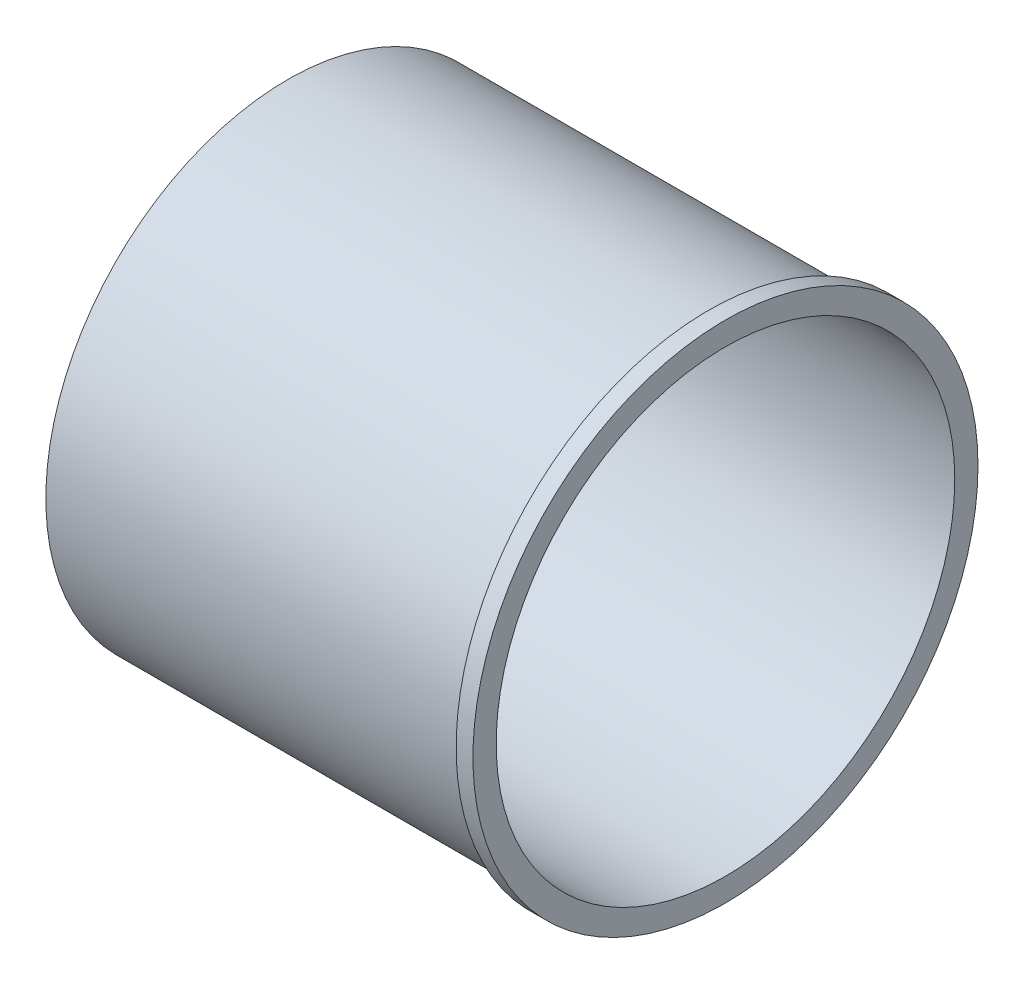
ISO-10303-21;
HEADER;
FILE_DESCRIPTION(('STEP AP214'),'2;1');
FILE_NAME('part.step','',(''),(''),'','','');
FILE_SCHEMA(('AUTOMOTIVE_DESIGN { 1 0 10303 214 1 1 1 1 }'));
ENDSEC;
DATA;
#1=APPLICATION_CONTEXT('core data for automotive mechanical design processes');
#2=APPLICATION_PROTOCOL_DEFINITION('international standard','automotive_design',2000,#1);
#3=PRODUCT_CONTEXT('',#1,'mechanical');
#4=PRODUCT('Part','Part','',(#3));
#5=PRODUCT_RELATED_PRODUCT_CATEGORY('part','',(#4));
#6=PRODUCT_DEFINITION_FORMATION('','',#4);
#7=PRODUCT_DEFINITION_CONTEXT('part definition',#1,'design');
#8=PRODUCT_DEFINITION('design','',#6,#7);
#9=PRODUCT_DEFINITION_SHAPE('','',#8);
#10=(LENGTH_UNIT() NAMED_UNIT(*) SI_UNIT(.MILLI.,.METRE.));
#11=(NAMED_UNIT(*) PLANE_ANGLE_UNIT() SI_UNIT($,.RADIAN.));
#12=(NAMED_UNIT(*) SI_UNIT($,.STERADIAN.) SOLID_ANGLE_UNIT());
#13=UNCERTAINTY_MEASURE_WITH_UNIT(LENGTH_MEASURE(1.E-05),#10,'distance_accuracy_value','');
#14=(GEOMETRIC_REPRESENTATION_CONTEXT(3) GLOBAL_UNCERTAINTY_ASSIGNED_CONTEXT((#13)) GLOBAL_UNIT_ASSIGNED_CONTEXT((#10,
#11,#12)) REPRESENTATION_CONTEXT('',''));
#15=CARTESIAN_POINT('',(0.,0.,0.));
#16=DIRECTION('',(0.,0.,1.));
#17=DIRECTION('',(1.,0.,0.));
#18=AXIS2_PLACEMENT_3D('',#15,#16,#17);
#19=CARTESIAN_POINT('',(0.,0.,0.));
#20=DIRECTION('',(1.,0.,0.));
#21=DIRECTION('',(0.,0.,-1.));
#22=AXIS2_PLACEMENT_3D('',#19,#20,#21);
#23=PLANE('',#22);
#24=CARTESIAN_POINT('',(0.,0.,0.));
#25=DIRECTION('',(1.,0.,0.));
#26=DIRECTION('',(0.,0.,-1.));
#27=AXIS2_PLACEMENT_3D('',#24,#25,#26);
#28=CIRCLE('',#27,36.4998);
#29=CARTESIAN_POINT('',(0.,0.,-36.4998));
#30=VERTEX_POINT('',#29);
#31=EDGE_CURVE('E47',#30,#30,#28,.T.);
#32=ORIENTED_EDGE('',*,*,#31,.F.);
#33=EDGE_LOOP('',(#32));
#34=FACE_BOUND('',#33,.T.);
#35=CARTESIAN_POINT('',(0.,0.,0.));
#36=DIRECTION('',(1.,0.,0.));
#37=DIRECTION('',(0.,0.,-1.));
#38=AXIS2_PLACEMENT_3D('',#35,#36,#37);
#39=CIRCLE('',#38,34.5948);
#40=CARTESIAN_POINT('',(0.,0.,-34.5948));
#41=VERTEX_POINT('',#40);
#42=EDGE_CURVE('E56',#41,#41,#39,.T.);
#43=ORIENTED_EDGE('',*,*,#42,.T.);
#44=EDGE_LOOP('',(#43));
#45=FACE_BOUND('',#44,.T.);
#46=ADVANCED_FACE('F43',(#34,#45),#23,.F.);
#47=CARTESIAN_POINT('',(63.5,0.,0.));
#48=DIRECTION('',(-1.,0.,0.));
#49=DIRECTION('',(0.,0.,1.));
#50=AXIS2_PLACEMENT_3D('',#47,#48,#49);
#51=CYLINDRICAL_SURFACE('',#50,36.4998);
#52=CARTESIAN_POINT('',(63.5,0.,0.));
#53=DIRECTION('',(1.,0.,0.));
#54=DIRECTION('',(0.,0.,-1.));
#55=AXIS2_PLACEMENT_3D('',#52,#53,#54);
#56=CIRCLE('',#55,36.4998);
#57=CARTESIAN_POINT('',(63.5,0.,-36.4998));
#58=VERTEX_POINT('',#57);
#59=EDGE_CURVE('E10',#58,#58,#56,.T.);
#60=ORIENTED_EDGE('',*,*,#59,.F.);
#61=EDGE_LOOP('',(#60));
#62=FACE_BOUND('',#61,.T.);
#63=ORIENTED_EDGE('',*,*,#31,.T.);
#64=EDGE_LOOP('',(#63));
#65=FACE_BOUND('',#64,.T.);
#66=ADVANCED_FACE('F45',(#62,#65),#51,.T.);
#67=CARTESIAN_POINT('',(63.5,0.,0.));
#68=DIRECTION('',(-1.,0.,0.));
#69=DIRECTION('',(0.,0.,1.));
#70=AXIS2_PLACEMENT_3D('',#67,#68,#69);
#71=CYLINDRICAL_SURFACE('',#70,34.5948);
#72=ORIENTED_EDGE('',*,*,#42,.F.);
#73=EDGE_LOOP('',(#72));
#74=FACE_BOUND('',#73,.T.);
#75=CARTESIAN_POINT('',(66.04,0.,0.));
#76=DIRECTION('',(1.,0.,0.));
#77=DIRECTION('',(0.,0.,-1.));
#78=AXIS2_PLACEMENT_3D('',#75,#76,#77);
#79=CIRCLE('',#78,34.5948);
#80=CARTESIAN_POINT('',(66.04,0.,-34.5948));
#81=VERTEX_POINT('',#80);
#82=EDGE_CURVE('E66',#81,#81,#79,.T.);
#83=ORIENTED_EDGE('',*,*,#82,.T.);
#84=EDGE_LOOP('',(#83));
#85=FACE_BOUND('',#84,.T.);
#86=ADVANCED_FACE('F74',(#74,#85),#71,.F.);
#87=CARTESIAN_POINT('',(66.04,0.,0.));
#88=DIRECTION('',(1.,0.,0.));
#89=DIRECTION('',(0.,0.,-1.));
#90=AXIS2_PLACEMENT_3D('',#87,#88,#89);
#91=PLANE('',#90);
#92=CARTESIAN_POINT('',(66.04,0.,0.));
#93=DIRECTION('',(1.,0.,0.));
#94=DIRECTION('',(0.,0.,-1.));
#95=AXIS2_PLACEMENT_3D('',#92,#93,#94);
#96=CIRCLE('',#95,38.1);
#97=CARTESIAN_POINT('',(66.04,0.,-38.1));
#98=VERTEX_POINT('',#97);
#99=EDGE_CURVE('E61',#98,#98,#96,.T.);
#100=ORIENTED_EDGE('',*,*,#99,.T.);
#101=EDGE_LOOP('',(#100));
#102=FACE_BOUND('',#101,.T.);
#103=ORIENTED_EDGE('',*,*,#82,.F.);
#104=EDGE_LOOP('',(#103));
#105=FACE_BOUND('',#104,.T.);
#106=ADVANCED_FACE('F76',(#102,#105),#91,.T.);
#107=CARTESIAN_POINT('',(63.5,0.,0.));
#108=DIRECTION('',(1.,0.,0.));
#109=DIRECTION('',(0.,0.,-1.));
#110=AXIS2_PLACEMENT_3D('',#107,#108,#109);
#111=PLANE('',#110);
#112=ORIENTED_EDGE('',*,*,#59,.T.);
#113=EDGE_LOOP('',(#112));
#114=FACE_BOUND('',#113,.T.);
#115=CARTESIAN_POINT('',(63.5,0.,0.));
#116=DIRECTION('',(1.,0.,0.));
#117=DIRECTION('',(0.,0.,-1.));
#118=AXIS2_PLACEMENT_3D('',#115,#116,#117);
#119=CIRCLE('',#118,38.1);
#120=CARTESIAN_POINT('',(63.5,0.,-38.1));
#121=VERTEX_POINT('',#120);
#122=EDGE_CURVE('E62',#121,#121,#119,.T.);
#123=ORIENTED_EDGE('',*,*,#122,.F.);
#124=EDGE_LOOP('',(#123));
#125=FACE_BOUND('',#124,.T.);
#126=ADVANCED_FACE('F78',(#114,#125),#111,.F.);
#127=CARTESIAN_POINT('',(66.04,0.,0.));
#128=DIRECTION('',(-1.,0.,0.));
#129=DIRECTION('',(0.,0.,1.));
#130=AXIS2_PLACEMENT_3D('',#127,#128,#129);
#131=CYLINDRICAL_SURFACE('',#130,38.1);
#132=ORIENTED_EDGE('',*,*,#99,.F.);
#133=EDGE_LOOP('',(#132));
#134=FACE_BOUND('',#133,.T.);
#135=ORIENTED_EDGE('',*,*,#122,.T.);
#136=EDGE_LOOP('',(#135));
#137=FACE_BOUND('',#136,.T.);
#138=ADVANCED_FACE('F85',(#134,#137),#131,.T.);
#139=CLOSED_SHELL('',(#46,#66,#86,#106,#126,#138));
#140=MANIFOLD_SOLID_BREP('B2',#139);
#141=ADVANCED_BREP_SHAPE_REPRESENTATION('',(#18,#140),#14);
#142=SHAPE_DEFINITION_REPRESENTATION(#9,#141);
ENDSEC;
END-ISO-10303-21;
